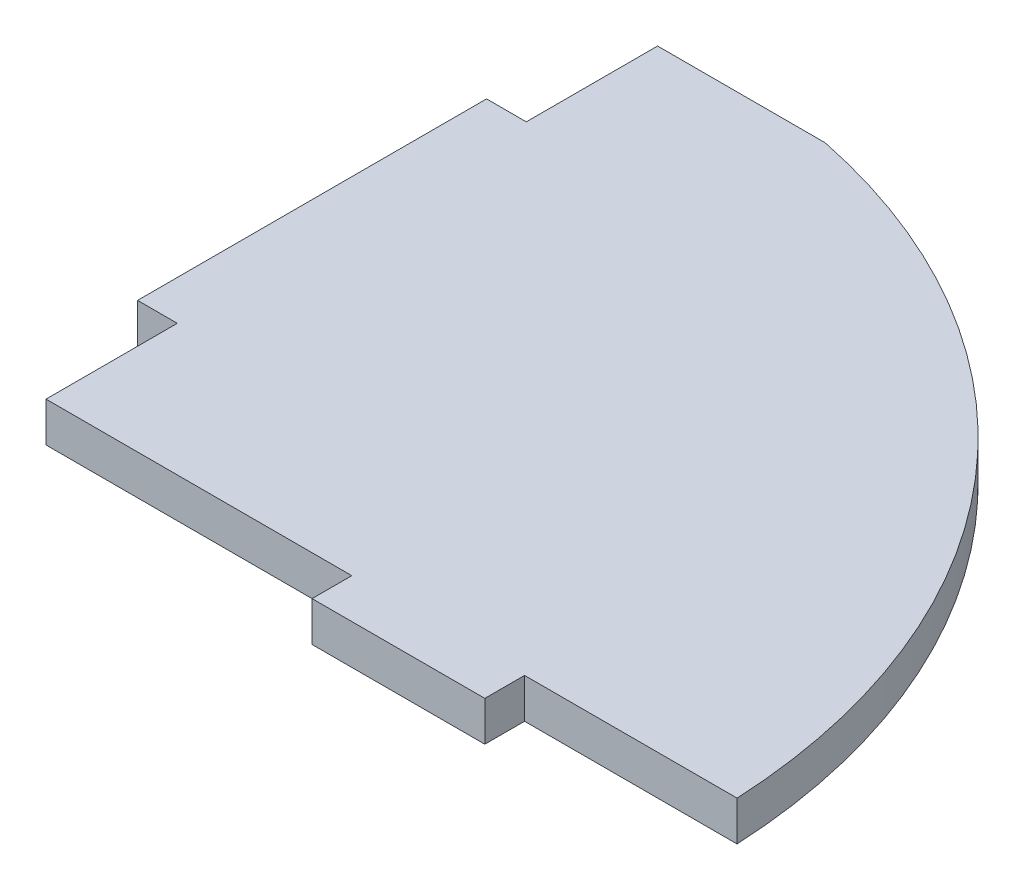
ISO-10303-21;
HEADER;
FILE_DESCRIPTION(('STEP AP214'),'2;1');
FILE_NAME('part.step','',(''),(''),'','','');
FILE_SCHEMA(('AUTOMOTIVE_DESIGN { 1 0 10303 214 1 1 1 1 }'));
ENDSEC;
DATA;
#1=APPLICATION_CONTEXT('core data for automotive mechanical design processes');
#2=APPLICATION_PROTOCOL_DEFINITION('international standard','automotive_design',2000,#1);
#3=PRODUCT_CONTEXT('',#1,'mechanical');
#4=PRODUCT('Part','Part','',(#3));
#5=PRODUCT_RELATED_PRODUCT_CATEGORY('part','',(#4));
#6=PRODUCT_DEFINITION_FORMATION('','',#4);
#7=PRODUCT_DEFINITION_CONTEXT('part definition',#1,'design');
#8=PRODUCT_DEFINITION('design','',#6,#7);
#9=PRODUCT_DEFINITION_SHAPE('','',#8);
#10=(LENGTH_UNIT() NAMED_UNIT(*) SI_UNIT(.MILLI.,.METRE.));
#11=(NAMED_UNIT(*) PLANE_ANGLE_UNIT() SI_UNIT($,.RADIAN.));
#12=(NAMED_UNIT(*) SI_UNIT($,.STERADIAN.) SOLID_ANGLE_UNIT());
#13=UNCERTAINTY_MEASURE_WITH_UNIT(LENGTH_MEASURE(1.E-05),#10,'distance_accuracy_value','');
#14=(GEOMETRIC_REPRESENTATION_CONTEXT(3) GLOBAL_UNCERTAINTY_ASSIGNED_CONTEXT((#13)) GLOBAL_UNIT_ASSIGNED_CONTEXT((#10,
#11,#12)) REPRESENTATION_CONTEXT('',''));
#15=CARTESIAN_POINT('',(0.,0.,0.));
#16=DIRECTION('',(0.,0.,1.));
#17=DIRECTION('',(1.,0.,0.));
#18=AXIS2_PLACEMENT_3D('',#15,#16,#17);
#19=CARTESIAN_POINT('',(0.,2.921,0.));
#20=DIRECTION('',(1.,0.,0.));
#21=DIRECTION('',(0.,0.,-1.));
#22=AXIS2_PLACEMENT_3D('',#19,#20,#21);
#23=PLANE('',#22);
#24=DIRECTION('',(0.,0.,1.));
#25=VECTOR('',#24,1.);
#26=CARTESIAN_POINT('',(0.,0.,0.));
#27=LINE('',#26,#25);
#28=CARTESIAN_POINT('',(0.,0.,-9.652));
#29=VERTEX_POINT('',#28);
#30=CARTESIAN_POINT('',(0.,0.,0.));
#31=VERTEX_POINT('',#30);
#32=EDGE_CURVE('E155',#29,#31,#27,.T.);
#33=ORIENTED_EDGE('',*,*,#32,.T.);
#34=DIRECTION('',(0.,-1.,0.));
#35=VECTOR('',#34,1.);
#36=CARTESIAN_POINT('',(0.,2.921,0.));
#37=LINE('',#36,#35);
#38=CARTESIAN_POINT('',(0.,2.921,0.));
#39=VERTEX_POINT('',#38);
#40=EDGE_CURVE('E11',#39,#31,#37,.T.);
#41=ORIENTED_EDGE('',*,*,#40,.F.);
#42=DIRECTION('',(0.,0.,1.));
#43=VECTOR('',#42,1.);
#44=CARTESIAN_POINT('',(0.,2.921,0.));
#45=LINE('',#44,#43);
#46=CARTESIAN_POINT('',(0.,2.921,-9.652));
#47=VERTEX_POINT('',#46);
#48=EDGE_CURVE('E177',#47,#39,#45,.T.);
#49=ORIENTED_EDGE('',*,*,#48,.F.);
#50=DIRECTION('',(0.,-1.,0.));
#51=VECTOR('',#50,1.);
#52=CARTESIAN_POINT('',(0.,2.921,-9.652));
#53=LINE('',#52,#51);
#54=EDGE_CURVE('E151',#47,#29,#53,.T.);
#55=ORIENTED_EDGE('',*,*,#54,.T.);
#56=EDGE_LOOP('',(#33,#41,#49,#55));
#57=FACE_BOUND('',#56,.T.);
#58=ADVANCED_FACE('F35',(#57),#23,.F.);
#59=CARTESIAN_POINT('',(0.,2.921,0.));
#60=DIRECTION('',(0.,0.,-1.));
#61=DIRECTION('',(-1.,0.,0.));
#62=AXIS2_PLACEMENT_3D('',#59,#60,#61);
#63=PLANE('',#62);
#64=DIRECTION('',(1.,0.,0.));
#65=VECTOR('',#64,1.);
#66=CARTESIAN_POINT('',(0.,0.,0.));
#67=LINE('',#66,#65);
#68=CARTESIAN_POINT('',(22.479,0.,0.));
#69=VERTEX_POINT('',#68);
#70=EDGE_CURVE('E158',#31,#69,#67,.T.);
#71=ORIENTED_EDGE('',*,*,#70,.T.);
#72=DIRECTION('',(0.,-1.,0.));
#73=VECTOR('',#72,1.);
#74=CARTESIAN_POINT('',(22.479,2.921,0.));
#75=LINE('',#74,#73);
#76=CARTESIAN_POINT('',(22.479,2.921,0.));
#77=VERTEX_POINT('',#76);
#78=EDGE_CURVE('E43',#77,#69,#75,.T.);
#79=ORIENTED_EDGE('',*,*,#78,.F.);
#80=DIRECTION('',(1.,0.,0.));
#81=VECTOR('',#80,1.);
#82=CARTESIAN_POINT('',(0.,2.921,0.));
#83=LINE('',#82,#81);
#84=EDGE_CURVE('E106',#39,#77,#83,.T.);
#85=ORIENTED_EDGE('',*,*,#84,.F.);
#86=ORIENTED_EDGE('',*,*,#40,.T.);
#87=EDGE_LOOP('',(#71,#79,#85,#86));
#88=FACE_BOUND('',#87,.T.);
#89=ADVANCED_FACE('F255',(#88),#63,.F.);
#90=CARTESIAN_POINT('',(22.479,2.921,0.));
#91=DIRECTION('',(1.,0.,0.));
#92=DIRECTION('',(0.,0.,-1.));
#93=AXIS2_PLACEMENT_3D('',#90,#91,#92);
#94=PLANE('',#93);
#95=DIRECTION('',(0.,0.,1.));
#96=VECTOR('',#95,1.);
#97=CARTESIAN_POINT('',(22.479,0.,0.));
#98=LINE('',#97,#96);
#99=CARTESIAN_POINT('',(22.479,0.,2.921));
#100=VERTEX_POINT('',#99);
#101=EDGE_CURVE('E160',#69,#100,#98,.T.);
#102=ORIENTED_EDGE('',*,*,#101,.T.);
#103=DIRECTION('',(0.,-1.,0.));
#104=VECTOR('',#103,1.);
#105=CARTESIAN_POINT('',(22.479,2.921,2.921));
#106=LINE('',#105,#104);
#107=CARTESIAN_POINT('',(22.479,2.921,2.921));
#108=VERTEX_POINT('',#107);
#109=EDGE_CURVE('E196',#108,#100,#106,.T.);
#110=ORIENTED_EDGE('',*,*,#109,.F.);
#111=DIRECTION('',(0.,0.,1.));
#112=VECTOR('',#111,1.);
#113=CARTESIAN_POINT('',(22.479,2.921,0.));
#114=LINE('',#113,#112);
#115=EDGE_CURVE('E204',#77,#108,#114,.T.);
#116=ORIENTED_EDGE('',*,*,#115,.F.);
#117=ORIENTED_EDGE('',*,*,#78,.T.);
#118=EDGE_LOOP('',(#102,#110,#116,#117));
#119=FACE_BOUND('',#118,.T.);
#120=ADVANCED_FACE('F202',(#119),#94,.F.);
#121=CARTESIAN_POINT('',(35.179,2.921,2.921));
#122=DIRECTION('',(0.,0.,-1.));
#123=DIRECTION('',(-1.,0.,0.));
#124=AXIS2_PLACEMENT_3D('',#121,#122,#123);
#125=PLANE('',#124);
#126=DIRECTION('',(1.,0.,0.));
#127=VECTOR('',#126,1.);
#128=CARTESIAN_POINT('',(35.179,0.,2.921));
#129=LINE('',#128,#127);
#130=CARTESIAN_POINT('',(35.179,0.,2.921));
#131=VERTEX_POINT('',#130);
#132=EDGE_CURVE('E162',#100,#131,#129,.T.);
#133=ORIENTED_EDGE('',*,*,#132,.T.);
#134=DIRECTION('',(0.,-1.,0.));
#135=VECTOR('',#134,1.);
#136=CARTESIAN_POINT('',(35.179,2.921,2.921));
#137=LINE('',#136,#135);
#138=CARTESIAN_POINT('',(35.179,2.921,2.921));
#139=VERTEX_POINT('',#138);
#140=EDGE_CURVE('E193',#139,#131,#137,.T.);
#141=ORIENTED_EDGE('',*,*,#140,.F.);
#142=DIRECTION('',(1.,0.,0.));
#143=VECTOR('',#142,1.);
#144=CARTESIAN_POINT('',(35.179,2.921,2.921));
#145=LINE('',#144,#143);
#146=EDGE_CURVE('E222',#108,#139,#145,.T.);
#147=ORIENTED_EDGE('',*,*,#146,.F.);
#148=ORIENTED_EDGE('',*,*,#109,.T.);
#149=EDGE_LOOP('',(#133,#141,#147,#148));
#150=FACE_BOUND('',#149,.T.);
#151=ADVANCED_FACE('F213',(#150),#125,.F.);
#152=CARTESIAN_POINT('',(35.179,2.921,0.));
#153=DIRECTION('',(-1.,0.,0.));
#154=DIRECTION('',(0.,0.,1.));
#155=AXIS2_PLACEMENT_3D('',#152,#153,#154);
#156=PLANE('',#155);
#157=DIRECTION('',(0.,0.,-1.));
#158=VECTOR('',#157,1.);
#159=CARTESIAN_POINT('',(35.179,0.,0.));
#160=LINE('',#159,#158);
#161=CARTESIAN_POINT('',(35.179,0.,0.));
#162=VERTEX_POINT('',#161);
#163=EDGE_CURVE('E164',#131,#162,#160,.T.);
#164=ORIENTED_EDGE('',*,*,#163,.T.);
#165=DIRECTION('',(0.,-1.,0.));
#166=VECTOR('',#165,1.);
#167=CARTESIAN_POINT('',(35.179,2.921,0.));
#168=LINE('',#167,#166);
#169=CARTESIAN_POINT('',(35.179,2.921,0.));
#170=VERTEX_POINT('',#169);
#171=EDGE_CURVE('E190',#170,#162,#168,.T.);
#172=ORIENTED_EDGE('',*,*,#171,.F.);
#173=DIRECTION('',(0.,0.,-1.));
#174=VECTOR('',#173,1.);
#175=CARTESIAN_POINT('',(35.179,2.921,0.));
#176=LINE('',#175,#174);
#177=EDGE_CURVE('E219',#139,#170,#176,.T.);
#178=ORIENTED_EDGE('',*,*,#177,.F.);
#179=ORIENTED_EDGE('',*,*,#140,.T.);
#180=EDGE_LOOP('',(#164,#172,#178,#179));
#181=FACE_BOUND('',#180,.T.);
#182=ADVANCED_FACE('F217',(#181),#156,.F.);
#183=CARTESIAN_POINT('',(35.179,2.921,0.));
#184=DIRECTION('',(0.,0.,-1.));
#185=DIRECTION('',(-1.,0.,0.));
#186=AXIS2_PLACEMENT_3D('',#183,#184,#185);
#187=PLANE('',#186);
#188=DIRECTION('',(1.,0.,0.));
#189=VECTOR('',#188,1.);
#190=CARTESIAN_POINT('',(35.179,0.,0.));
#191=LINE('',#190,#189);
#192=CARTESIAN_POINT('',(50.8,0.,0.));
#193=VERTEX_POINT('',#192);
#194=EDGE_CURVE('E166',#162,#193,#191,.T.);
#195=ORIENTED_EDGE('',*,*,#194,.T.);
#196=DIRECTION('',(0.,-1.,0.));
#197=VECTOR('',#196,1.);
#198=CARTESIAN_POINT('',(50.8,2.921,0.));
#199=LINE('',#198,#197);
#200=CARTESIAN_POINT('',(50.8,2.921,0.));
#201=VERTEX_POINT('',#200);
#202=EDGE_CURVE('E187',#201,#193,#199,.T.);
#203=ORIENTED_EDGE('',*,*,#202,.F.);
#204=DIRECTION('',(1.,0.,0.));
#205=VECTOR('',#204,1.);
#206=CARTESIAN_POINT('',(35.179,2.921,0.));
#207=LINE('',#206,#205);
#208=EDGE_CURVE('E221',#170,#201,#207,.T.);
#209=ORIENTED_EDGE('',*,*,#208,.F.);
#210=ORIENTED_EDGE('',*,*,#171,.T.);
#211=EDGE_LOOP('',(#195,#203,#209,#210));
#212=FACE_BOUND('',#211,.T.);
#213=ADVANCED_FACE('F268',(#212),#187,.F.);
#214=CARTESIAN_POINT('',(2.56331273115708,2.921,2.33977045892487));
#215=DIRECTION('',(0.,-1.,0.));
#216=DIRECTION('',(0.,0.,-1.));
#217=AXIS2_PLACEMENT_3D('',#214,#215,#216);
#218=CYLINDRICAL_SURFACE('',#217,48.2934004235839);
#219=CARTESIAN_POINT('',(2.56331273115708,0.,2.33977045892487));
#220=DIRECTION('',(0.,1.,0.));
#221=DIRECTION('',(0.,0.,-1.));
#222=AXIS2_PLACEMENT_3D('',#219,#220,#221);
#223=CIRCLE('',#222,48.2934004235839);
#224=CARTESIAN_POINT('',(12.319,0.,-44.958));
#225=VERTEX_POINT('',#224);
#226=EDGE_CURVE('E168',#193,#225,#223,.T.);
#227=ORIENTED_EDGE('',*,*,#226,.T.);
#228=DIRECTION('',(0.,-1.,0.));
#229=VECTOR('',#228,1.);
#230=CARTESIAN_POINT('',(12.319,2.921,-44.958));
#231=LINE('',#230,#229);
#232=CARTESIAN_POINT('',(12.319,2.921,-44.958));
#233=VERTEX_POINT('',#232);
#234=EDGE_CURVE('E184',#233,#225,#231,.T.);
#235=ORIENTED_EDGE('',*,*,#234,.F.);
#236=CARTESIAN_POINT('',(2.56331273115708,2.921,2.33977045892487));
#237=DIRECTION('',(0.,1.,0.));
#238=DIRECTION('',(0.,0.,-1.));
#239=AXIS2_PLACEMENT_3D('',#236,#237,#238);
#240=CIRCLE('',#239,48.2934004235839);
#241=EDGE_CURVE('E224',#201,#233,#240,.T.);
#242=ORIENTED_EDGE('',*,*,#241,.F.);
#243=ORIENTED_EDGE('',*,*,#202,.T.);
#244=EDGE_LOOP('',(#227,#235,#242,#243));
#245=FACE_BOUND('',#244,.T.);
#246=ADVANCED_FACE('F271',(#245),#218,.T.);
#247=CARTESIAN_POINT('',(0.,2.921,-44.958));
#248=DIRECTION('',(0.,0.,1.));
#249=DIRECTION('',(1.,0.,0.));
#250=AXIS2_PLACEMENT_3D('',#247,#248,#249);
#251=PLANE('',#250);
#252=DIRECTION('',(-1.,0.,0.));
#253=VECTOR('',#252,1.);
#254=CARTESIAN_POINT('',(0.,0.,-44.958));
#255=LINE('',#254,#253);
#256=CARTESIAN_POINT('',(0.,0.,-44.958));
#257=VERTEX_POINT('',#256);
#258=EDGE_CURVE('E170',#225,#257,#255,.T.);
#259=ORIENTED_EDGE('',*,*,#258,.T.);
#260=DIRECTION('',(0.,-1.,0.));
#261=VECTOR('',#260,1.);
#262=CARTESIAN_POINT('',(0.,2.921,-44.958));
#263=LINE('',#262,#261);
#264=CARTESIAN_POINT('',(0.,2.921,-44.958));
#265=VERTEX_POINT('',#264);
#266=EDGE_CURVE('E181',#265,#257,#263,.T.);
#267=ORIENTED_EDGE('',*,*,#266,.F.);
#268=DIRECTION('',(-1.,0.,0.));
#269=VECTOR('',#268,1.);
#270=CARTESIAN_POINT('',(0.,2.921,-44.958));
#271=LINE('',#270,#269);
#272=EDGE_CURVE('E230',#233,#265,#271,.T.);
#273=ORIENTED_EDGE('',*,*,#272,.F.);
#274=ORIENTED_EDGE('',*,*,#234,.T.);
#275=EDGE_LOOP('',(#259,#267,#273,#274));
#276=FACE_BOUND('',#275,.T.);
#277=ADVANCED_FACE('F236',(#276),#251,.F.);
#278=CARTESIAN_POINT('',(0.,2.921,-35.306));
#279=DIRECTION('',(1.,0.,0.));
#280=DIRECTION('',(0.,0.,-1.));
#281=AXIS2_PLACEMENT_3D('',#278,#279,#280);
#282=PLANE('',#281);
#283=DIRECTION('',(0.,0.,1.));
#284=VECTOR('',#283,1.);
#285=CARTESIAN_POINT('',(0.,0.,-35.306));
#286=LINE('',#285,#284);
#287=CARTESIAN_POINT('',(0.,0.,-35.306));
#288=VERTEX_POINT('',#287);
#289=EDGE_CURVE('E172',#257,#288,#286,.T.);
#290=ORIENTED_EDGE('',*,*,#289,.T.);
#291=DIRECTION('',(0.,-1.,0.));
#292=VECTOR('',#291,1.);
#293=CARTESIAN_POINT('',(0.,2.921,-35.306));
#294=LINE('',#293,#292);
#295=CARTESIAN_POINT('',(0.,2.921,-35.306));
#296=VERTEX_POINT('',#295);
#297=EDGE_CURVE('E146',#296,#288,#294,.T.);
#298=ORIENTED_EDGE('',*,*,#297,.F.);
#299=DIRECTION('',(0.,0.,1.));
#300=VECTOR('',#299,1.);
#301=CARTESIAN_POINT('',(0.,2.921,-35.306));
#302=LINE('',#301,#300);
#303=EDGE_CURVE('E137',#265,#296,#302,.T.);
#304=ORIENTED_EDGE('',*,*,#303,.F.);
#305=ORIENTED_EDGE('',*,*,#266,.T.);
#306=EDGE_LOOP('',(#290,#298,#304,#305));
#307=FACE_BOUND('',#306,.T.);
#308=ADVANCED_FACE('F240',(#307),#282,.F.);
#309=CARTESIAN_POINT('',(0.,2.921,-35.306));
#310=DIRECTION('',(0.,0.,1.));
#311=DIRECTION('',(1.,0.,0.));
#312=AXIS2_PLACEMENT_3D('',#309,#310,#311);
#313=PLANE('',#312);
#314=DIRECTION('',(-1.,0.,0.));
#315=VECTOR('',#314,1.);
#316=CARTESIAN_POINT('',(0.,0.,-35.306));
#317=LINE('',#316,#315);
#318=CARTESIAN_POINT('',(-2.921,0.,-35.306));
#319=VERTEX_POINT('',#318);
#320=EDGE_CURVE('E145',#288,#319,#317,.T.);
#321=ORIENTED_EDGE('',*,*,#320,.T.);
#322=DIRECTION('',(0.,-1.,0.));
#323=VECTOR('',#322,1.);
#324=CARTESIAN_POINT('',(-2.921,2.921,-35.306));
#325=LINE('',#324,#323);
#326=CARTESIAN_POINT('',(-2.921,2.921,-35.306));
#327=VERTEX_POINT('',#326);
#328=EDGE_CURVE('E142',#327,#319,#325,.T.);
#329=ORIENTED_EDGE('',*,*,#328,.F.);
#330=DIRECTION('',(-1.,0.,0.));
#331=VECTOR('',#330,1.);
#332=CARTESIAN_POINT('',(0.,2.921,-35.306));
#333=LINE('',#332,#331);
#334=EDGE_CURVE('E131',#296,#327,#333,.T.);
#335=ORIENTED_EDGE('',*,*,#334,.F.);
#336=ORIENTED_EDGE('',*,*,#297,.T.);
#337=EDGE_LOOP('',(#321,#329,#335,#336));
#338=FACE_BOUND('',#337,.T.);
#339=ADVANCED_FACE('F143',(#338),#313,.F.);
#340=CARTESIAN_POINT('',(-2.921,2.921,-35.306));
#341=DIRECTION('',(1.,0.,0.));
#342=DIRECTION('',(0.,0.,-1.));
#343=AXIS2_PLACEMENT_3D('',#340,#341,#342);
#344=PLANE('',#343);
#345=DIRECTION('',(0.,0.,1.));
#346=VECTOR('',#345,1.);
#347=CARTESIAN_POINT('',(-2.921,0.,-35.306));
#348=LINE('',#347,#346);
#349=CARTESIAN_POINT('',(-2.921,0.,-9.652));
#350=VERTEX_POINT('',#349);
#351=EDGE_CURVE('E92',#319,#350,#348,.T.);
#352=ORIENTED_EDGE('',*,*,#351,.T.);
#353=DIRECTION('',(0.,-1.,0.));
#354=VECTOR('',#353,1.);
#355=CARTESIAN_POINT('',(-2.921,2.921,-9.652));
#356=LINE('',#355,#354);
#357=CARTESIAN_POINT('',(-2.921,2.921,-9.652));
#358=VERTEX_POINT('',#357);
#359=EDGE_CURVE('E147',#358,#350,#356,.T.);
#360=ORIENTED_EDGE('',*,*,#359,.F.);
#361=DIRECTION('',(0.,0.,1.));
#362=VECTOR('',#361,1.);
#363=CARTESIAN_POINT('',(-2.921,2.921,-35.306));
#364=LINE('',#363,#362);
#365=EDGE_CURVE('E135',#327,#358,#364,.T.);
#366=ORIENTED_EDGE('',*,*,#365,.F.);
#367=ORIENTED_EDGE('',*,*,#328,.T.);
#368=EDGE_LOOP('',(#352,#360,#366,#367));
#369=FACE_BOUND('',#368,.T.);
#370=ADVANCED_FACE('F149',(#369),#344,.F.);
#371=CARTESIAN_POINT('',(0.,2.921,-9.652));
#372=DIRECTION('',(0.,0.,-1.));
#373=DIRECTION('',(-1.,0.,0.));
#374=AXIS2_PLACEMENT_3D('',#371,#372,#373);
#375=PLANE('',#374);
#376=DIRECTION('',(1.,0.,0.));
#377=VECTOR('',#376,1.);
#378=CARTESIAN_POINT('',(0.,0.,-9.652));
#379=LINE('',#378,#377);
#380=EDGE_CURVE('E98',#350,#29,#379,.T.);
#381=ORIENTED_EDGE('',*,*,#380,.T.);
#382=ORIENTED_EDGE('',*,*,#54,.F.);
#383=DIRECTION('',(1.,0.,0.));
#384=VECTOR('',#383,1.);
#385=CARTESIAN_POINT('',(0.,2.921,-9.652));
#386=LINE('',#385,#384);
#387=EDGE_CURVE('E51',#358,#47,#386,.T.);
#388=ORIENTED_EDGE('',*,*,#387,.F.);
#389=ORIENTED_EDGE('',*,*,#359,.T.);
#390=EDGE_LOOP('',(#381,#382,#388,#389));
#391=FACE_BOUND('',#390,.T.);
#392=ADVANCED_FACE('F244',(#391),#375,.F.);
#393=CARTESIAN_POINT('',(2.56331273115708,2.921,2.33977045892487));
#394=DIRECTION('',(0.,-1.,0.));
#395=DIRECTION('',(0.,0.,-1.));
#396=AXIS2_PLACEMENT_3D('',#393,#394,#395);
#397=PLANE('',#396);
#398=ORIENTED_EDGE('',*,*,#48,.T.);
#399=ORIENTED_EDGE('',*,*,#84,.T.);
#400=ORIENTED_EDGE('',*,*,#115,.T.);
#401=ORIENTED_EDGE('',*,*,#146,.T.);
#402=ORIENTED_EDGE('',*,*,#177,.T.);
#403=ORIENTED_EDGE('',*,*,#208,.T.);
#404=ORIENTED_EDGE('',*,*,#241,.T.);
#405=ORIENTED_EDGE('',*,*,#272,.T.);
#406=ORIENTED_EDGE('',*,*,#303,.T.);
#407=ORIENTED_EDGE('',*,*,#334,.T.);
#408=ORIENTED_EDGE('',*,*,#365,.T.);
#409=ORIENTED_EDGE('',*,*,#387,.T.);
#410=EDGE_LOOP('',(#398,#399,#400,#401,#402,#403,#404,#405,#406,#407,#408,#409));
#411=FACE_BOUND('',#410,.T.);
#412=ADVANCED_FACE('F133',(#411),#397,.F.);
#413=CARTESIAN_POINT('',(2.56331273115708,0.,2.33977045892487));
#414=DIRECTION('',(0.,-1.,0.));
#415=DIRECTION('',(0.,0.,-1.));
#416=AXIS2_PLACEMENT_3D('',#413,#414,#415);
#417=PLANE('',#416);
#418=ORIENTED_EDGE('',*,*,#32,.F.);
#419=ORIENTED_EDGE('',*,*,#380,.F.);
#420=ORIENTED_EDGE('',*,*,#351,.F.);
#421=ORIENTED_EDGE('',*,*,#320,.F.);
#422=ORIENTED_EDGE('',*,*,#289,.F.);
#423=ORIENTED_EDGE('',*,*,#258,.F.);
#424=ORIENTED_EDGE('',*,*,#226,.F.);
#425=ORIENTED_EDGE('',*,*,#194,.F.);
#426=ORIENTED_EDGE('',*,*,#163,.F.);
#427=ORIENTED_EDGE('',*,*,#132,.F.);
#428=ORIENTED_EDGE('',*,*,#101,.F.);
#429=ORIENTED_EDGE('',*,*,#70,.F.);
#430=EDGE_LOOP('',(#418,#419,#420,#421,#422,#423,#424,#425,#426,#427,#428,#429));
#431=FACE_BOUND('',#430,.T.);
#432=ADVANCED_FACE('F208',(#431),#417,.T.);
#433=CLOSED_SHELL('',(#58,#89,#120,#151,#182,#213,#246,#277,#308,#339,#370,#392,#412,#432));
#434=MANIFOLD_SOLID_BREP('B2',#433);
#435=ADVANCED_BREP_SHAPE_REPRESENTATION('',(#18,#434),#14);
#436=SHAPE_DEFINITION_REPRESENTATION(#9,#435);
ENDSEC;
END-ISO-10303-21;
